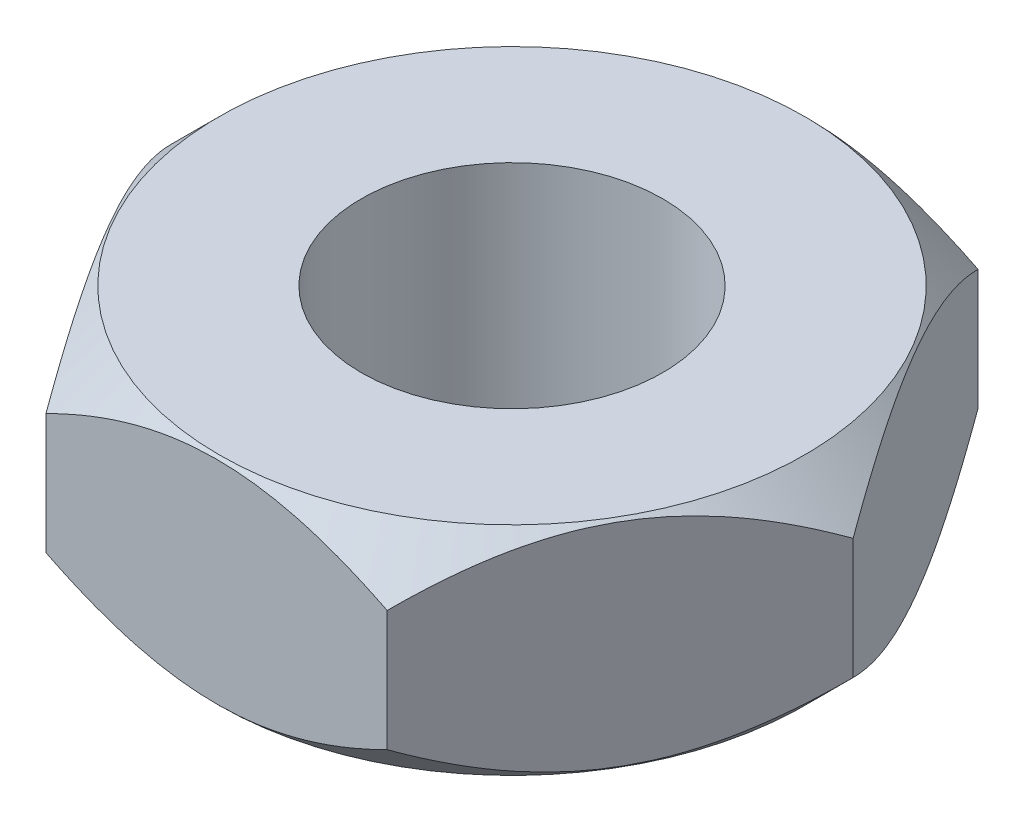
ISO-10303-21;
HEADER;
FILE_DESCRIPTION(('STEP AP214'),'2;1');
FILE_NAME('part.step','',(''),(''),'','','');
FILE_SCHEMA(('AUTOMOTIVE_DESIGN { 1 0 10303 214 1 1 1 1 }'));
ENDSEC;
DATA;
#1=APPLICATION_CONTEXT('core data for automotive mechanical design processes');
#2=APPLICATION_PROTOCOL_DEFINITION('international standard','automotive_design',2000,#1);
#3=PRODUCT_CONTEXT('',#1,'mechanical');
#4=PRODUCT('Part','Part','',(#3));
#5=PRODUCT_RELATED_PRODUCT_CATEGORY('part','',(#4));
#6=PRODUCT_DEFINITION_FORMATION('','',#4);
#7=PRODUCT_DEFINITION_CONTEXT('part definition',#1,'design');
#8=PRODUCT_DEFINITION('design','',#6,#7);
#9=PRODUCT_DEFINITION_SHAPE('','',#8);
#10=(LENGTH_UNIT() NAMED_UNIT(*) SI_UNIT(.MILLI.,.METRE.));
#11=(NAMED_UNIT(*) PLANE_ANGLE_UNIT() SI_UNIT($,.RADIAN.));
#12=(NAMED_UNIT(*) SI_UNIT($,.STERADIAN.) SOLID_ANGLE_UNIT());
#13=UNCERTAINTY_MEASURE_WITH_UNIT(LENGTH_MEASURE(1.E-05),#10,'distance_accuracy_value','');
#14=(GEOMETRIC_REPRESENTATION_CONTEXT(3) GLOBAL_UNCERTAINTY_ASSIGNED_CONTEXT((#13)) GLOBAL_UNIT_ASSIGNED_CONTEXT((#10,
#11,#12)) REPRESENTATION_CONTEXT('',''));
#15=CARTESIAN_POINT('',(0.,0.,0.));
#16=DIRECTION('',(0.,0.,1.));
#17=DIRECTION('',(1.,0.,0.));
#18=AXIS2_PLACEMENT_3D('',#15,#16,#17);
#19=CARTESIAN_POINT('',(0.,0.,0.));
#20=DIRECTION('',(0.,1.,0.));
#21=DIRECTION('',(0.,0.,1.));
#22=AXIS2_PLACEMENT_3D('',#19,#20,#21);
#23=PLANE('',#22);
#24=CARTESIAN_POINT('',(0.,0.,0.));
#25=DIRECTION('',(0.,1.,0.));
#26=DIRECTION('',(0.,0.,1.));
#27=AXIS2_PLACEMENT_3D('',#24,#25,#26);
#28=CIRCLE('',#27,1.25);
#29=CARTESIAN_POINT('',(0.,0.,1.25));
#30=VERTEX_POINT('',#29);
#31=EDGE_CURVE('E241',#30,#30,#28,.T.);
#32=ORIENTED_EDGE('',*,*,#31,.T.);
#33=EDGE_LOOP('',(#32));
#34=FACE_BOUND('',#33,.T.);
#35=CARTESIAN_POINT('',(0.,0.,0.));
#36=DIRECTION('',(0.,1.,0.));
#37=DIRECTION('',(0.,0.,1.));
#38=AXIS2_PLACEMENT_3D('',#35,#36,#37);
#39=CIRCLE('',#38,2.42901631902917);
#40=CARTESIAN_POINT('',(0.,0.,2.42901631902917));
#41=VERTEX_POINT('',#40);
#42=EDGE_CURVE('E113',#41,#41,#39,.T.);
#43=ORIENTED_EDGE('',*,*,#42,.F.);
#44=EDGE_LOOP('',(#43));
#45=FACE_BOUND('',#44,.T.);
#46=ADVANCED_FACE('F39',(#34,#45),#23,.F.);
#47=CARTESIAN_POINT('',(0.,1.8,0.));
#48=DIRECTION('',(0.,1.,0.));
#49=DIRECTION('',(0.,0.,1.));
#50=AXIS2_PLACEMENT_3D('',#47,#48,#49);
#51=PLANE('',#50);
#52=CARTESIAN_POINT('',(0.,1.8,0.));
#53=DIRECTION('',(0.,1.,0.));
#54=DIRECTION('',(0.,0.,1.));
#55=AXIS2_PLACEMENT_3D('',#52,#53,#54);
#56=CIRCLE('',#55,1.25);
#57=CARTESIAN_POINT('',(0.,1.8,1.25));
#58=VERTEX_POINT('',#57);
#59=EDGE_CURVE('E123',#58,#58,#56,.T.);
#60=ORIENTED_EDGE('',*,*,#59,.F.);
#61=EDGE_LOOP('',(#60));
#62=FACE_BOUND('',#61,.T.);
#63=CARTESIAN_POINT('',(0.,1.8,0.));
#64=DIRECTION('',(0.,1.,0.));
#65=DIRECTION('',(0.,0.,1.));
#66=AXIS2_PLACEMENT_3D('',#63,#64,#65);
#67=CIRCLE('',#66,2.42901631902917);
#68=CARTESIAN_POINT('',(0.,1.8,2.42901631902917));
#69=VERTEX_POINT('',#68);
#70=EDGE_CURVE('E222',#69,#69,#67,.T.);
#71=ORIENTED_EDGE('',*,*,#70,.T.);
#72=EDGE_LOOP('',(#71));
#73=FACE_BOUND('',#72,.T.);
#74=ADVANCED_FACE('F252',(#62,#73),#51,.T.);
#75=CARTESIAN_POINT('',(2.82901631902917,1.8,0.));
#76=DIRECTION('',(-0.866025403784438,0.,0.5));
#77=DIRECTION('',(0.5,0.,0.866025403784439));
#78=AXIS2_PLACEMENT_3D('',#75,#76,#77);
#79=PLANE('',#78);
#80=DIRECTION('',(0.,-1.,0.));
#81=VECTOR('',#80,1.);
#82=CARTESIAN_POINT('',(2.82901631902917,1.8,0.));
#83=LINE('',#82,#81);
#84=CARTESIAN_POINT('',(2.82901631902917,1.4,0.));
#85=VERTEX_POINT('',#84);
#86=CARTESIAN_POINT('',(2.82901631902917,0.4,0.));
#87=VERTEX_POINT('',#86);
#88=EDGE_CURVE('E117',#85,#87,#83,.T.);
#89=ORIENTED_EDGE('',*,*,#88,.T.);
#90=CARTESIAN_POINT('',(2.82913178908301,0.400115477123145,0.000199999999999504));
#91=CARTESIAN_POINT('',(2.78050749178405,0.351531943816685,-0.0840197534041309));
#92=CARTESIAN_POINT('',(2.73107012483881,0.305801731436073,-0.169647784745699));
#93=CARTESIAN_POINT('',(2.6302618520895,0.222070694541585,-0.344252834970767));
#94=CARTESIAN_POINT('',(2.57888135853392,0.184116459538144,-0.433246460327001));
#95=CARTESIAN_POINT('',(2.47527503835683,0.119100055169454,-0.612697870858978));
#96=CARTESIAN_POINT('',(2.42307559924255,0.0918744644052159,-0.703109951531505));
#97=CARTESIAN_POINT('',(2.3175275294839,0.0499277399986241,-0.885924570994309));
#98=CARTESIAN_POINT('',(2.26418212344496,0.0351752929292085,-0.978321524604146));
#99=CARTESIAN_POINT('',(2.17224460225891,0.0218648011828623,-1.13756198242032));
#100=CARTESIAN_POINT('',(2.1337712695682,0.0198943646775737,-1.20419974937713));
#101=CARTESIAN_POINT('',(2.0568874896419,0.0232135932201699,-1.33736636248743));
#102=CARTESIAN_POINT('',(2.01847706917854,0.028505803532813,-1.40389516227005));
#103=CARTESIAN_POINT('',(1.942018908021,0.0460491662814278,-1.5363245820482));
#104=CARTESIAN_POINT('',(1.90397162154857,0.0583081035916648,-1.60222441530857));
#105=CARTESIAN_POINT('',(1.82853497675801,0.0891119947496022,-1.73288451683836));
#106=CARTESIAN_POINT('',(1.79114556823417,0.107656466711311,-1.7976448720666));
#107=CARTESIAN_POINT('',(1.69537481345656,0.162710075568889,-1.96352468522063));
#108=CARTESIAN_POINT('',(1.63758730067765,0.203369132338794,-2.06361559339673));
#109=CARTESIAN_POINT('',(1.55261584194407,0.272007224329872,-2.21079047711654));
#110=CARTESIAN_POINT('',(1.52461395323958,0.296123497161931,-2.25929117106061));
#111=CARTESIAN_POINT('',(1.46912887056141,0.346554429845183,-2.35539415332136));
#112=CARTESIAN_POINT('',(1.44164537067441,0.372867740032936,-2.40299697149545));
#113=CARTESIAN_POINT('',(1.41439268946074,0.400115477123144,-2.4502));
#114=B_SPLINE_CURVE_WITH_KNOTS('',3,(#90,#91,#92,#93,#94,#95,#96,#97,#98,#99,#100,#101,#102,
#103,#104,#105,#106,#107,#108,#109,#110,#111,#112,#113),.UNSPECIFIED.,.F.,.F.,(4,2,2,2,2,2,2,2,
2,2,2,4),(0.,0.326352937962233,0.654607441550946,0.977648366171207,1.2998758783641,
1.53046472398209,1.76113440233005,1.9920623476298,2.22297259264043,2.58975777202036,
2.77265307102351,2.95543683068299),.UNSPECIFIED.);
#115=CARTESIAN_POINT('',(1.41450815951459,0.4,-2.45));
#116=VERTEX_POINT('',#115);
#117=EDGE_CURVE('E62',#87,#116,#114,.T.);
#118=ORIENTED_EDGE('',*,*,#117,.T.);
#119=DIRECTION('',(0.,-1.,0.));
#120=VECTOR('',#119,1.);
#121=CARTESIAN_POINT('',(1.41450815951458,1.8,-2.45));
#122=LINE('',#121,#120);
#123=CARTESIAN_POINT('',(1.41450815951459,1.4,-2.45));
#124=VERTEX_POINT('',#123);
#125=EDGE_CURVE('E134',#124,#116,#122,.T.);
#126=ORIENTED_EDGE('',*,*,#125,.F.);
#127=CARTESIAN_POINT('',(1.41439268946075,1.39988452287686,-2.4502));
#128=CARTESIAN_POINT('',(1.4630169867597,1.44846805618332,-2.36598024659587));
#129=CARTESIAN_POINT('',(1.51245435370494,1.49419826856393,-2.2803522152543));
#130=CARTESIAN_POINT('',(1.61326262645425,1.57792930545842,-2.10574716502923));
#131=CARTESIAN_POINT('',(1.66464312000983,1.61588354046186,-2.016753539673));
#132=CARTESIAN_POINT('',(1.76824944018692,1.68089994483055,-1.83730212914102));
#133=CARTESIAN_POINT('',(1.8204488793012,1.70812553559478,-1.7468900484685));
#134=CARTESIAN_POINT('',(1.92599694905985,1.75007226000138,-1.56407542900569));
#135=CARTESIAN_POINT('',(1.97934235509879,1.76482470707079,-1.47167847539586));
#136=CARTESIAN_POINT('',(2.07127987628484,1.77813519881714,-1.31243801757968));
#137=CARTESIAN_POINT('',(2.10975320897555,1.78010563532243,-1.24580025062287));
#138=CARTESIAN_POINT('',(2.18663698890185,1.77678640677983,-1.11263363751258));
#139=CARTESIAN_POINT('',(2.22504740936521,1.77149419646719,-1.04610483772995));
#140=CARTESIAN_POINT('',(2.30150557052275,1.75395083371857,-0.913675417951802));
#141=CARTESIAN_POINT('',(2.33955285699518,1.74169189640833,-0.84777558469143));
#142=CARTESIAN_POINT('',(2.41498950178574,1.7108880052504,-0.717115483161645));
#143=CARTESIAN_POINT('',(2.45237891030958,1.69234353328869,-0.652355127933404));
#144=CARTESIAN_POINT('',(2.54814966508719,1.63728992443111,-0.486475314779377));
#145=CARTESIAN_POINT('',(2.6059371778661,1.59663086766121,-0.386384406603269));
#146=CARTESIAN_POINT('',(2.69090863659968,1.52799277567013,-0.239209522883458));
#147=CARTESIAN_POINT('',(2.71891052530417,1.50387650283807,-0.190708828939396));
#148=CARTESIAN_POINT('',(2.77439560798234,1.45344557015482,-0.0946058466786421));
#149=CARTESIAN_POINT('',(2.80187910786934,1.42713225996706,-0.0470030285045498));
#150=CARTESIAN_POINT('',(2.82913178908301,1.39988452287686,0.000199999999999433));
#151=B_SPLINE_CURVE_WITH_KNOTS('',3,(#127,#128,#129,#130,#131,#132,#133,#134,#135,#136,#137,
#138,#139,#140,#141,#142,#143,#144,#145,#146,#147,#148,#149,#150),.UNSPECIFIED.,.F.,.F.,(4,2,2,
2,2,2,2,2,2,2,2,4),(0.,0.326352937962232,0.654607441550944,0.977648366171205,1.29987587836409,
1.53046472398209,1.76113440233005,1.9920623476298,2.22297259264043,2.58975777202036,
2.77265307102351,2.95543683068299),.UNSPECIFIED.);
#152=EDGE_CURVE('E188',#124,#85,#151,.T.);
#153=ORIENTED_EDGE('',*,*,#152,.T.);
#154=EDGE_LOOP('',(#89,#118,#126,#153));
#155=FACE_BOUND('',#154,.T.);
#156=ADVANCED_FACE('F41',(#155),#79,.F.);
#157=CARTESIAN_POINT('',(1.41450815951458,1.8,-2.45));
#158=DIRECTION('',(0.,0.,1.));
#159=DIRECTION('',(1.,0.,0.));
#160=AXIS2_PLACEMENT_3D('',#157,#158,#159);
#161=PLANE('',#160);
#162=ORIENTED_EDGE('',*,*,#125,.T.);
#163=CARTESIAN_POINT('',(4.27186292139454,2.49554587665742,-2.45));
#164=CARTESIAN_POINT('',(4.14551153302819,2.38598406192926,-2.45));
#165=CARTESIAN_POINT('',(4.01859865175386,2.27705642977799,-2.45));
#166=CARTESIAN_POINT('',(3.76321447753472,2.06092177782122,-2.45));
#167=CARTESIAN_POINT('',(3.6347424725801,1.95371560038954,-2.45));
#168=CARTESIAN_POINT('',(3.37295254295558,1.73914571047158,-2.45));
#169=CARTESIAN_POINT('',(3.23959108340829,1.63183490469603,-2.45));
#170=CARTESIAN_POINT('',(2.97035431990019,1.4204688538915,-2.45));
#171=CARTESIAN_POINT('',(2.83447965425152,1.31641279979837,-2.45));
#172=CARTESIAN_POINT('',(2.55920228372678,1.11265307836512,-2.45));
#173=CARTESIAN_POINT('',(2.4197951075342,1.01295541209634,-2.45));
#174=CARTESIAN_POINT('',(2.13639207785251,0.819964170547471,-2.45));
#175=CARTESIAN_POINT('',(1.99239260103339,0.726675844932527,-2.45));
#176=CARTESIAN_POINT('',(1.69959705459969,0.550500353680368,-2.45));
#177=CARTESIAN_POINT('',(1.55084639414118,0.467538709868794,-2.45));
#178=CARTESIAN_POINT('',(1.24600447328249,0.316447313920822,-2.45));
#179=CARTESIAN_POINT('',(1.08992736026093,0.248290299667585,-2.45));
#180=CARTESIAN_POINT('',(0.847878222934536,0.162423442207641,-2.45));
#181=CARTESIAN_POINT('',(0.76489354746257,0.136332394763868,-2.45));
#182=CARTESIAN_POINT('',(0.596967225292628,0.0913664546315873,-2.45));
#183=CARTESIAN_POINT('',(0.512025893204577,0.0724904103151569,-2.45));
#184=CARTESIAN_POINT('',(0.341210118144986,0.0432090804314749,-2.45));
#185=CARTESIAN_POINT('',(0.255344716626254,0.0327520389968132,-2.45));
#186=CARTESIAN_POINT('',(0.0829856214669755,0.0208817831477808,-2.45));
#187=CARTESIAN_POINT('',(-0.00350800458784327,0.0194676098978603,-2.45));
#188=CARTESIAN_POINT('',(-0.176268590614348,0.0257965616657364,-2.45));
#189=CARTESIAN_POINT('',(-0.262535088205447,0.0335520266523028,-2.45));
#190=CARTESIAN_POINT('',(-0.43385077999469,0.0576529809683251,-2.45));
#191=CARTESIAN_POINT('',(-0.518899730533234,0.0740001656827407,-2.45));
#192=CARTESIAN_POINT('',(-0.687767208797417,0.114356463620096,-2.45));
#193=CARTESIAN_POINT('',(-0.771572683915479,0.138419241684951,-2.45));
#194=CARTESIAN_POINT('',(-0.937057576452355,0.19290428108841,-2.45));
#195=CARTESIAN_POINT('',(-1.01873696884641,0.223326617243275,-2.45));
#196=CARTESIAN_POINT('',(-1.19804907671647,0.296731924694768,-2.45));
#197=CARTESIAN_POINT('',(-1.29515055097318,0.341001671133104,-2.45));
#198=CARTESIAN_POINT('',(-1.48646278142325,0.435446387900791,-2.45));
#199=CARTESIAN_POINT('',(-1.58067182882374,0.485624767415403,-2.45));
#200=CARTESIAN_POINT('',(-1.76673188803279,0.590574779627123,-2.45));
#201=CARTESIAN_POINT('',(-1.85857761498132,0.645355705428766,-2.45));
#202=CARTESIAN_POINT('',(-2.04008281492777,0.758364857132515,-2.45));
#203=CARTESIAN_POINT('',(-2.12974271721017,0.816592398310407,-2.45));
#204=CARTESIAN_POINT('',(-2.30771997179025,0.936053823858122,-2.45));
#205=CARTESIAN_POINT('',(-2.39602766490823,0.997302032388855,-2.45));
#206=CARTESIAN_POINT('',(-2.57111481221653,1.12195021618773,-2.45));
#207=CARTESIAN_POINT('',(-2.65789415046204,1.18535035364769,-2.45));
#208=CARTESIAN_POINT('',(-2.91611438553936,1.37795249172371,-2.45));
#209=CARTESIAN_POINT('',(-3.08565185321096,1.50970327610133,-2.45));
#210=CARTESIAN_POINT('',(-3.42724046011718,1.78258658306106,-2.45));
#211=CARTESIAN_POINT('',(-3.59915695758109,1.92388600119051,-2.45));
#212=CARTESIAN_POINT('',(-3.8540020594881,2.13757318007686,-2.45));
#213=CARTESIAN_POINT('',(-3.93799446029769,2.20869847153329,-2.45));
#214=CARTESIAN_POINT('',(-4.1053632260958,2.35163408126385,-2.45));
#215=CARTESIAN_POINT('',(-4.18873972031461,2.42344424814846,-2.45));
#216=CARTESIAN_POINT('',(-4.27186292139454,2.49554587665742,-2.45));
#217=B_SPLINE_CURVE_WITH_KNOTS('',3,(#163,#164,#165,#166,#167,#168,#169,#170,#171,#172,#173,
#174,#175,#176,#177,#178,#179,#180,#181,#182,#183,#184,#185,#186,#187,#188,#189,#190,#191,#192,
#193,#194,#195,#196,#197,#198,#199,#200,#201,#202,#203,#204,#205,#206,#207,#208,#209,#210,#211,
#212,#213,#214,#215,#216),.UNSPECIFIED.,.F.,.F.,(4,2,2,2,2,2,2,2,2,2,2,2,2,2,2,2,2,2,2,2,2,2,2,
2,2,2,4),(0.,0.501724217254908,1.00368689273523,1.51717555137169,2.03053553619984,
2.54458143132047,3.05904346401958,3.56954871210008,4.07910576272412,4.33981440286418,
4.60048141241221,4.85953346507799,5.11855804941938,5.37793161118708,5.63735637379002,
5.89862616725506,6.15989903457032,6.47977845371037,6.79984335087857,7.12057078820679,
7.44123472047046,7.76360168279388,8.08599299624604,8.72999642841388,9.39754020272861,
9.7277215400781,10.0578315096794),.UNSPECIFIED.);
#218=CARTESIAN_POINT('',(-1.41450815951458,0.4,-2.45));
#219=VERTEX_POINT('',#218);
#220=EDGE_CURVE('E202',#116,#219,#217,.T.);
#221=ORIENTED_EDGE('',*,*,#220,.T.);
#222=DIRECTION('',(0.,-1.,0.));
#223=VECTOR('',#222,1.);
#224=CARTESIAN_POINT('',(-1.41450815951458,1.8,-2.45));
#225=LINE('',#224,#223);
#226=CARTESIAN_POINT('',(-1.41450815951458,1.4,-2.45));
#227=VERTEX_POINT('',#226);
#228=EDGE_CURVE('E130',#227,#219,#225,.T.);
#229=ORIENTED_EDGE('',*,*,#228,.F.);
#230=CARTESIAN_POINT('',(-4.27186292139454,-0.695545876657422,-2.45));
#231=CARTESIAN_POINT('',(-4.14551153302819,-0.585984061929255,-2.45));
#232=CARTESIAN_POINT('',(-4.01859865175386,-0.47705642977799,-2.45));
#233=CARTESIAN_POINT('',(-3.76321447753472,-0.260921777821218,-2.45));
#234=CARTESIAN_POINT('',(-3.6347424725801,-0.153715600389544,-2.45));
#235=CARTESIAN_POINT('',(-3.37295254295558,0.0608542895284178,-2.45));
#236=CARTESIAN_POINT('',(-3.23959108340829,0.168165095303967,-2.45));
#237=CARTESIAN_POINT('',(-2.97035431990019,0.379531146108499,-2.45));
#238=CARTESIAN_POINT('',(-2.83447965425152,0.483587200201632,-2.45));
#239=CARTESIAN_POINT('',(-2.55920228372678,0.68734692163488,-2.45));
#240=CARTESIAN_POINT('',(-2.4197951075342,0.787044587903664,-2.45));
#241=CARTESIAN_POINT('',(-2.13639207785251,0.98003582945253,-2.45));
#242=CARTESIAN_POINT('',(-1.99239260103339,1.07332415506747,-2.45));
#243=CARTESIAN_POINT('',(-1.69959705459969,1.24949964631963,-2.45));
#244=CARTESIAN_POINT('',(-1.55084639414118,1.33246129013121,-2.45));
#245=CARTESIAN_POINT('',(-1.24600447328249,1.48355268607918,-2.45));
#246=CARTESIAN_POINT('',(-1.08992736026093,1.55170970033241,-2.45));
#247=CARTESIAN_POINT('',(-0.847878222934535,1.63757655779236,-2.45));
#248=CARTESIAN_POINT('',(-0.764893547462569,1.66366760523613,-2.45));
#249=CARTESIAN_POINT('',(-0.596967225292627,1.70863354536841,-2.45));
#250=CARTESIAN_POINT('',(-0.512025893204577,1.72750958968484,-2.45));
#251=CARTESIAN_POINT('',(-0.341210118144986,1.75679091956853,-2.45));
#252=CARTESIAN_POINT('',(-0.255344716626253,1.76724796100319,-2.45));
#253=CARTESIAN_POINT('',(-0.0829856214669752,1.77911821685222,-2.45));
#254=CARTESIAN_POINT('',(0.00350800458784353,1.78053239010214,-2.45));
#255=CARTESIAN_POINT('',(0.176268590614348,1.77420343833426,-2.45));
#256=CARTESIAN_POINT('',(0.262535088205447,1.7664479733477,-2.45));
#257=CARTESIAN_POINT('',(0.433850779994689,1.74234701903167,-2.45));
#258=CARTESIAN_POINT('',(0.518899730533233,1.72599983431726,-2.45));
#259=CARTESIAN_POINT('',(0.687767208797416,1.6856435363799,-2.45));
#260=CARTESIAN_POINT('',(0.771572683915479,1.66158075831505,-2.45));
#261=CARTESIAN_POINT('',(0.937057576452354,1.60709571891159,-2.45));
#262=CARTESIAN_POINT('',(1.01873696884641,1.57667338275673,-2.45));
#263=CARTESIAN_POINT('',(1.19804907671647,1.50326807530523,-2.45));
#264=CARTESIAN_POINT('',(1.29515055097318,1.4589983288669,-2.45));
#265=CARTESIAN_POINT('',(1.48646278142325,1.36455361209921,-2.45));
#266=CARTESIAN_POINT('',(1.58067182882374,1.3143752325846,-2.45));
#267=CARTESIAN_POINT('',(1.76673188803279,1.20942522037288,-2.45));
#268=CARTESIAN_POINT('',(1.85857761498132,1.15464429457123,-2.45));
#269=CARTESIAN_POINT('',(2.04008281492777,1.04163514286748,-2.45));
#270=CARTESIAN_POINT('',(2.12974271721017,0.983407601689593,-2.45));
#271=CARTESIAN_POINT('',(2.30771997179025,0.863946176141878,-2.45));
#272=CARTESIAN_POINT('',(2.39602766490822,0.802697967611145,-2.45));
#273=CARTESIAN_POINT('',(2.57111481221653,0.678049783812272,-2.45));
#274=CARTESIAN_POINT('',(2.65789415046204,0.614649646352306,-2.45));
#275=CARTESIAN_POINT('',(2.91611438553936,0.422047508276293,-2.45));
#276=CARTESIAN_POINT('',(3.08565185321096,0.290296723898673,-2.45));
#277=CARTESIAN_POINT('',(3.42724046011718,0.0174134169389441,-2.45));
#278=CARTESIAN_POINT('',(3.59915695758109,-0.12388600119051,-2.45));
#279=CARTESIAN_POINT('',(3.8540020594881,-0.33757318007686,-2.45));
#280=CARTESIAN_POINT('',(3.93799446029769,-0.408698471533291,-2.45));
#281=CARTESIAN_POINT('',(4.1053632260958,-0.551634081263854,-2.45));
#282=CARTESIAN_POINT('',(4.18873972031461,-0.623444248148463,-2.45));
#283=CARTESIAN_POINT('',(4.27186292139454,-0.695545876657422,-2.45));
#284=B_SPLINE_CURVE_WITH_KNOTS('',3,(#230,#231,#232,#233,#234,#235,#236,#237,#238,#239,#240,
#241,#242,#243,#244,#245,#246,#247,#248,#249,#250,#251,#252,#253,#254,#255,#256,#257,#258,#259,
#260,#261,#262,#263,#264,#265,#266,#267,#268,#269,#270,#271,#272,#273,#274,#275,#276,#277,#278,
#279,#280,#281,#282,#283),.UNSPECIFIED.,.F.,.F.,(4,2,2,2,2,2,2,2,2,2,2,2,2,2,2,2,2,2,2,2,2,2,2,
2,2,2,4),(0.,0.501724217254908,1.00368689273523,1.51717555137169,2.03053553619984,
2.54458143132047,3.05904346401958,3.56954871210008,4.07910576272412,4.33981440286417,
4.60048141241221,4.85953346507799,5.11855804941938,5.37793161118708,5.63735637379002,
5.89862616725506,6.15989903457032,6.47977845371037,6.79984335087857,7.12057078820679,
7.44123472047046,7.76360168279387,8.08599299624604,8.72999642841388,9.39754020272861,
9.7277215400781,10.0578315096794),.UNSPECIFIED.);
#285=EDGE_CURVE('E181',#227,#124,#284,.T.);
#286=ORIENTED_EDGE('',*,*,#285,.T.);
#287=EDGE_LOOP('',(#162,#221,#229,#286));
#288=FACE_BOUND('',#287,.T.);
#289=ADVANCED_FACE('F194',(#288),#161,.F.);
#290=CARTESIAN_POINT('',(-1.41450815951458,1.8,-2.45));
#291=DIRECTION('',(0.866025403784439,0.,0.5));
#292=DIRECTION('',(0.5,0.,-0.866025403784439));
#293=AXIS2_PLACEMENT_3D('',#290,#291,#292);
#294=PLANE('',#293);
#295=ORIENTED_EDGE('',*,*,#228,.T.);
#296=CARTESIAN_POINT('',(-1.41439268946074,0.400115477123143,-2.4502));
#297=CARTESIAN_POINT('',(-1.4630169867597,0.351531943816684,-2.36598024659587));
#298=CARTESIAN_POINT('',(-1.51245435370494,0.305801731436072,-2.2803522152543));
#299=CARTESIAN_POINT('',(-1.61326262645425,0.222070694541584,-2.10574716502923));
#300=CARTESIAN_POINT('',(-1.66464312000983,0.184116459538142,-2.016753539673));
#301=CARTESIAN_POINT('',(-1.76824944018692,0.119100055169453,-1.83730212914102));
#302=CARTESIAN_POINT('',(-1.8204488793012,0.0918744644052142,-1.74689004846849));
#303=CARTESIAN_POINT('',(-1.92599694905985,0.0499277399986224,-1.56407542900569));
#304=CARTESIAN_POINT('',(-1.97934235509879,0.0351752929292067,-1.47167847539585));
#305=CARTESIAN_POINT('',(-2.07127987628484,0.0218648011828606,-1.31243801757968));
#306=CARTESIAN_POINT('',(-2.10975320897555,0.0198943646775722,-1.24580025062287));
#307=CARTESIAN_POINT('',(-2.18663698890185,0.0232135932201683,-1.11263363751258));
#308=CARTESIAN_POINT('',(-2.22504740936521,0.0285058035328113,-1.04610483772995));
#309=CARTESIAN_POINT('',(-2.30150557052275,0.0460491662814259,-0.913675417951799));
#310=CARTESIAN_POINT('',(-2.33955285699518,0.0583081035916627,-0.847775584691427));
#311=CARTESIAN_POINT('',(-2.41498950178574,0.0891119947496001,-0.717115483161642));
#312=CARTESIAN_POINT('',(-2.45237891030958,0.10765646671131,-0.652355127933401));
#313=CARTESIAN_POINT('',(-2.54814966508718,0.162710075568887,-0.486475314779374));
#314=CARTESIAN_POINT('',(-2.60593717786609,0.203369132338791,-0.386384406603266));
#315=CARTESIAN_POINT('',(-2.69090863659968,0.27200722432987,-0.239209522883455));
#316=CARTESIAN_POINT('',(-2.71891052530417,0.29612349716193,-0.190708828939394));
#317=CARTESIAN_POINT('',(-2.77439560798234,0.346554429845182,-0.0946058466786403));
#318=CARTESIAN_POINT('',(-2.80187910786934,0.372867740032935,-0.0470030285045479));
#319=CARTESIAN_POINT('',(-2.829131789083,0.400115477123143,0.000200000000001428));
#320=B_SPLINE_CURVE_WITH_KNOTS('',3,(#296,#297,#298,#299,#300,#301,#302,#303,#304,#305,#306,
#307,#308,#309,#310,#311,#312,#313,#314,#315,#316,#317,#318,#319),.UNSPECIFIED.,.F.,.F.,(4,2,2,
2,2,2,2,2,2,2,2,4),(0.,0.326352937962233,0.654607441550946,0.977648366171207,1.2998758783641,
1.53046472398209,1.76113440233005,1.9920623476298,2.22297259264043,2.58975777202036,
2.77265307102351,2.95543683068299),.UNSPECIFIED.);
#321=CARTESIAN_POINT('',(-2.82901631902917,0.4,0.));
#322=VERTEX_POINT('',#321);
#323=EDGE_CURVE('E211',#219,#322,#320,.T.);
#324=ORIENTED_EDGE('',*,*,#323,.T.);
#325=DIRECTION('',(0.,-1.,0.));
#326=VECTOR('',#325,1.);
#327=CARTESIAN_POINT('',(-2.82901631902917,1.8,0.));
#328=LINE('',#327,#326);
#329=CARTESIAN_POINT('',(-2.82901631902917,1.4,0.));
#330=VERTEX_POINT('',#329);
#331=EDGE_CURVE('E121',#330,#322,#328,.T.);
#332=ORIENTED_EDGE('',*,*,#331,.F.);
#333=CARTESIAN_POINT('',(-2.829131789083,1.39988452287686,0.000200000000001365));
#334=CARTESIAN_POINT('',(-2.78050749178404,1.44846805618332,-0.0840197534041292));
#335=CARTESIAN_POINT('',(-2.73107012483881,1.49419826856393,-0.169647784745697));
#336=CARTESIAN_POINT('',(-2.6302618520895,1.57792930545842,-0.344252834970765));
#337=CARTESIAN_POINT('',(-2.57888135853392,1.61588354046186,-0.433246460326998));
#338=CARTESIAN_POINT('',(-2.47527503835682,1.68089994483055,-0.612697870858975));
#339=CARTESIAN_POINT('',(-2.42307559924255,1.70812553559479,-0.703109951531502));
#340=CARTESIAN_POINT('',(-2.3175275294839,1.75007226000138,-0.885924570994306));
#341=CARTESIAN_POINT('',(-2.26418212344496,1.76482470707079,-0.978321524604143));
#342=CARTESIAN_POINT('',(-2.17224460225891,1.77813519881714,-1.13756198242032));
#343=CARTESIAN_POINT('',(-2.1337712695682,1.78010563532243,-1.20419974937713));
#344=CARTESIAN_POINT('',(-2.0568874896419,1.77678640677983,-1.33736636248742));
#345=CARTESIAN_POINT('',(-2.01847706917854,1.77149419646719,-1.40389516227005));
#346=CARTESIAN_POINT('',(-1.942018908021,1.75395083371857,-1.5363245820482));
#347=CARTESIAN_POINT('',(-1.90397162154857,1.74169189640834,-1.60222441530857));
#348=CARTESIAN_POINT('',(-1.82853497675801,1.7108880052504,-1.73288451683836));
#349=CARTESIAN_POINT('',(-1.79114556823417,1.69234353328869,-1.7976448720666));
#350=CARTESIAN_POINT('',(-1.69537481345656,1.63728992443111,-1.96352468522062));
#351=CARTESIAN_POINT('',(-1.63758730067765,1.59663086766121,-2.06361559339673));
#352=CARTESIAN_POINT('',(-1.55261584194407,1.52799277567013,-2.21079047711654));
#353=CARTESIAN_POINT('',(-1.52461395323958,1.50387650283807,-2.2592911710606));
#354=CARTESIAN_POINT('',(-1.46912887056141,1.45344557015482,-2.35539415332136));
#355=CARTESIAN_POINT('',(-1.44164537067441,1.42713225996706,-2.40299697149545));
#356=CARTESIAN_POINT('',(-1.41439268946074,1.39988452287686,-2.4502));
#357=B_SPLINE_CURVE_WITH_KNOTS('',3,(#333,#334,#335,#336,#337,#338,#339,#340,#341,#342,#343,
#344,#345,#346,#347,#348,#349,#350,#351,#352,#353,#354,#355,#356),.UNSPECIFIED.,.F.,.F.,(4,2,2,
2,2,2,2,2,2,2,2,4),(0.,0.326352937962232,0.654607441550945,0.977648366171206,1.29987587836409,
1.53046472398209,1.76113440233005,1.9920623476298,2.22297259264043,2.58975777202036,
2.77265307102351,2.95543683068299),.UNSPECIFIED.);
#358=EDGE_CURVE('E174',#330,#227,#357,.T.);
#359=ORIENTED_EDGE('',*,*,#358,.T.);
#360=EDGE_LOOP('',(#295,#324,#332,#359));
#361=FACE_BOUND('',#360,.T.);
#362=ADVANCED_FACE('F197',(#361),#294,.F.);
#363=CARTESIAN_POINT('',(-2.82901631902917,1.8,0.));
#364=DIRECTION('',(0.866025403784438,0.,-0.5));
#365=DIRECTION('',(-0.5,0.,-0.866025403784439));
#366=AXIS2_PLACEMENT_3D('',#363,#364,#365);
#367=PLANE('',#366);
#368=ORIENTED_EDGE('',*,*,#331,.T.);
#369=CARTESIAN_POINT('',(-2.829131789083,0.400115477123142,-0.000199999999998685));
#370=CARTESIAN_POINT('',(-2.78050749178404,0.351531943816683,0.0840197534041316));
#371=CARTESIAN_POINT('',(-2.73107012483881,0.305801731436071,0.1696477847457));
#372=CARTESIAN_POINT('',(-2.6302618520895,0.222070694541583,0.344252834970768));
#373=CARTESIAN_POINT('',(-2.57888135853392,0.184116459538142,0.433246460327));
#374=CARTESIAN_POINT('',(-2.47527503835682,0.119100055169453,0.612697870858978));
#375=CARTESIAN_POINT('',(-2.42307559924255,0.0918744644052145,0.703109951531504));
#376=CARTESIAN_POINT('',(-2.3175275294839,0.0499277399986225,0.885924570994308));
#377=CARTESIAN_POINT('',(-2.26418212344496,0.0351752929292069,0.978321524604144));
#378=CARTESIAN_POINT('',(-2.17224460225891,0.0218648011828609,1.13756198242032));
#379=CARTESIAN_POINT('',(-2.1337712695682,0.0198943646775725,1.20419974937713));
#380=CARTESIAN_POINT('',(-2.0568874896419,0.0232135932201685,1.33736636248742));
#381=CARTESIAN_POINT('',(-2.01847706917854,0.0285058035328112,1.40389516227005));
#382=CARTESIAN_POINT('',(-1.942018908021,0.0460491662814259,1.5363245820482));
#383=CARTESIAN_POINT('',(-1.90397162154857,0.058308103591663,1.60222441530857));
#384=CARTESIAN_POINT('',(-1.82853497675801,0.0891119947496005,1.73288451683836));
#385=CARTESIAN_POINT('',(-1.79114556823416,0.10765646671131,1.7976448720666));
#386=CARTESIAN_POINT('',(-1.69537481345656,0.162710075568887,1.96352468522062));
#387=CARTESIAN_POINT('',(-1.63758730067765,0.203369132338792,2.06361559339673));
#388=CARTESIAN_POINT('',(-1.55261584194407,0.272007224329871,2.21079047711654));
#389=CARTESIAN_POINT('',(-1.52461395323958,0.296123497161931,2.25929117106061));
#390=CARTESIAN_POINT('',(-1.46912887056141,0.346554429845183,2.35539415332136));
#391=CARTESIAN_POINT('',(-1.44164537067441,0.372867740032936,2.40299697149545));
#392=CARTESIAN_POINT('',(-1.41439268946074,0.400115477123144,2.4502));
#393=B_SPLINE_CURVE_WITH_KNOTS('',3,(#369,#370,#371,#372,#373,#374,#375,#376,#377,#378,#379,
#380,#381,#382,#383,#384,#385,#386,#387,#388,#389,#390,#391,#392),.UNSPECIFIED.,.F.,.F.,(4,2,2,
2,2,2,2,2,2,2,2,4),(0.,0.326352937962233,0.654607441550945,0.977648366171205,1.29987587836409,
1.53046472398209,1.76113440233005,1.9920623476298,2.22297259264043,2.58975777202036,
2.77265307102351,2.95543683068299),.UNSPECIFIED.);
#394=CARTESIAN_POINT('',(-1.41450815951458,0.4,2.45));
#395=VERTEX_POINT('',#394);
#396=EDGE_CURVE('E112',#322,#395,#393,.T.);
#397=ORIENTED_EDGE('',*,*,#396,.T.);
#398=DIRECTION('',(0.,-1.,0.));
#399=VECTOR('',#398,1.);
#400=CARTESIAN_POINT('',(-1.41450815951458,1.8,2.45));
#401=LINE('',#400,#399);
#402=CARTESIAN_POINT('',(-1.41450815951458,1.4,2.45));
#403=VERTEX_POINT('',#402);
#404=EDGE_CURVE('E110',#403,#395,#401,.T.);
#405=ORIENTED_EDGE('',*,*,#404,.F.);
#406=CARTESIAN_POINT('',(-1.41439268946074,1.39988452287686,2.4502));
#407=CARTESIAN_POINT('',(-1.4630169867597,1.44846805618332,2.36598024659587));
#408=CARTESIAN_POINT('',(-1.51245435370493,1.49419826856393,2.2803522152543));
#409=CARTESIAN_POINT('',(-1.61326262645425,1.57792930545842,2.10574716502923));
#410=CARTESIAN_POINT('',(-1.66464312000983,1.61588354046186,2.016753539673));
#411=CARTESIAN_POINT('',(-1.76824944018692,1.68089994483055,1.83730212914102));
#412=CARTESIAN_POINT('',(-1.8204488793012,1.70812553559479,1.7468900484685));
#413=CARTESIAN_POINT('',(-1.92599694905985,1.75007226000138,1.56407542900569));
#414=CARTESIAN_POINT('',(-1.97934235509879,1.76482470707079,1.47167847539586));
#415=CARTESIAN_POINT('',(-2.07127987628484,1.77813519881714,1.31243801757968));
#416=CARTESIAN_POINT('',(-2.10975320897555,1.78010563532243,1.24580025062287));
#417=CARTESIAN_POINT('',(-2.18663698890185,1.77678640677983,1.11263363751258));
#418=CARTESIAN_POINT('',(-2.22504740936521,1.77149419646719,1.04610483772995));
#419=CARTESIAN_POINT('',(-2.30150557052275,1.75395083371857,0.913675417951802));
#420=CARTESIAN_POINT('',(-2.33955285699518,1.74169189640834,0.84777558469143));
#421=CARTESIAN_POINT('',(-2.41498950178574,1.7108880052504,0.717115483161645));
#422=CARTESIAN_POINT('',(-2.45237891030958,1.69234353328869,0.652355127933404));
#423=CARTESIAN_POINT('',(-2.54814966508718,1.63728992443111,0.486475314779377));
#424=CARTESIAN_POINT('',(-2.60593717786609,1.59663086766121,0.386384406603269));
#425=CARTESIAN_POINT('',(-2.69090863659968,1.52799277567013,0.239209522883458));
#426=CARTESIAN_POINT('',(-2.71891052530417,1.50387650283807,0.190708828939396));
#427=CARTESIAN_POINT('',(-2.77439560798234,1.45344557015482,0.0946058466786428));
#428=CARTESIAN_POINT('',(-2.80187910786934,1.42713225996706,0.0470030285045505));
#429=CARTESIAN_POINT('',(-2.829131789083,1.39988452287686,-0.000199999999998797));
#430=B_SPLINE_CURVE_WITH_KNOTS('',3,(#406,#407,#408,#409,#410,#411,#412,#413,#414,#415,#416,
#417,#418,#419,#420,#421,#422,#423,#424,#425,#426,#427,#428,#429),.UNSPECIFIED.,.F.,.F.,(4,2,2,
2,2,2,2,2,2,2,2,4),(0.,0.326352937962233,0.654607441550946,0.977648366171206,1.29987587836409,
1.53046472398209,1.76113440233005,1.9920623476298,2.22297259264043,2.58975777202036,
2.77265307102351,2.95543683068299),.UNSPECIFIED.);
#431=EDGE_CURVE('E167',#403,#330,#430,.T.);
#432=ORIENTED_EDGE('',*,*,#431,.T.);
#433=EDGE_LOOP('',(#368,#397,#405,#432));
#434=FACE_BOUND('',#433,.T.);
#435=ADVANCED_FACE('F276',(#434),#367,.F.);
#436=CARTESIAN_POINT('',(-1.41450815951458,1.8,2.45));
#437=DIRECTION('',(0.,0.,-1.));
#438=DIRECTION('',(-1.,0.,0.));
#439=AXIS2_PLACEMENT_3D('',#436,#437,#438);
#440=PLANE('',#439);
#441=ORIENTED_EDGE('',*,*,#404,.T.);
#442=CARTESIAN_POINT('',(-4.27186292139454,2.49554587665742,2.45));
#443=CARTESIAN_POINT('',(-4.14551153302819,2.38598406192925,2.45));
#444=CARTESIAN_POINT('',(-4.01859865175386,2.27705642977799,2.45));
#445=CARTESIAN_POINT('',(-3.76321447753472,2.06092177782122,2.45));
#446=CARTESIAN_POINT('',(-3.6347424725801,1.95371560038954,2.45));
#447=CARTESIAN_POINT('',(-3.37295254295558,1.73914571047158,2.45));
#448=CARTESIAN_POINT('',(-3.23959108340829,1.63183490469603,2.45));
#449=CARTESIAN_POINT('',(-2.97035431990019,1.4204688538915,2.45));
#450=CARTESIAN_POINT('',(-2.83447965425152,1.31641279979837,2.45));
#451=CARTESIAN_POINT('',(-2.55920228372678,1.11265307836512,2.45));
#452=CARTESIAN_POINT('',(-2.4197951075342,1.01295541209634,2.45));
#453=CARTESIAN_POINT('',(-2.13639207785251,0.819964170547471,2.45));
#454=CARTESIAN_POINT('',(-1.99239260103338,0.726675844932527,2.45));
#455=CARTESIAN_POINT('',(-1.69959705459969,0.550500353680368,2.45));
#456=CARTESIAN_POINT('',(-1.55084639414118,0.467538709868793,2.45));
#457=CARTESIAN_POINT('',(-1.24600447328249,0.316447313920822,2.45));
#458=CARTESIAN_POINT('',(-1.08992736026093,0.248290299667585,2.45));
#459=CARTESIAN_POINT('',(-0.847878222934535,0.162423442207641,2.45));
#460=CARTESIAN_POINT('',(-0.764893547462569,0.136332394763868,2.45));
#461=CARTESIAN_POINT('',(-0.596967225292627,0.0913664546315877,2.45));
#462=CARTESIAN_POINT('',(-0.512025893204577,0.0724904103151575,2.45));
#463=CARTESIAN_POINT('',(-0.341210118144986,0.0432090804314757,2.45));
#464=CARTESIAN_POINT('',(-0.255344716626253,0.0327520389968139,2.45));
#465=CARTESIAN_POINT('',(-0.0829856214669751,0.0208817831477815,2.45));
#466=CARTESIAN_POINT('',(0.00350800458784389,0.0194676098978609,2.45));
#467=CARTESIAN_POINT('',(0.176268590614349,0.025796561665737,2.45));
#468=CARTESIAN_POINT('',(0.262535088205448,0.0335520266523034,2.45));
#469=CARTESIAN_POINT('',(0.43385077999469,0.0576529809683257,2.45));
#470=CARTESIAN_POINT('',(0.518899730533234,0.0740001656827412,2.45));
#471=CARTESIAN_POINT('',(0.687767208797417,0.114356463620097,2.45));
#472=CARTESIAN_POINT('',(0.771572683915479,0.138419241684951,2.45));
#473=CARTESIAN_POINT('',(0.937057576452355,0.19290428108841,2.45));
#474=CARTESIAN_POINT('',(1.01873696884641,0.223326617243275,2.45));
#475=CARTESIAN_POINT('',(1.19804907671647,0.296731924694768,2.45));
#476=CARTESIAN_POINT('',(1.29515055097318,0.341001671133105,2.45));
#477=CARTESIAN_POINT('',(1.48646278142325,0.435446387900792,2.45));
#478=CARTESIAN_POINT('',(1.58067182882374,0.485624767415404,2.45));
#479=CARTESIAN_POINT('',(1.76673188803279,0.590574779627124,2.45));
#480=CARTESIAN_POINT('',(1.85857761498132,0.645355705428767,2.45));
#481=CARTESIAN_POINT('',(2.04008281492777,0.758364857132515,2.45));
#482=CARTESIAN_POINT('',(2.12974271721017,0.816592398310407,2.45));
#483=CARTESIAN_POINT('',(2.30771997179025,0.936053823858122,2.45));
#484=CARTESIAN_POINT('',(2.39602766490823,0.997302032388855,2.45));
#485=CARTESIAN_POINT('',(2.57111481221653,1.12195021618773,2.45));
#486=CARTESIAN_POINT('',(2.65789415046204,1.18535035364769,2.45));
#487=CARTESIAN_POINT('',(2.91611438553936,1.37795249172371,2.45));
#488=CARTESIAN_POINT('',(3.08565185321096,1.50970327610133,2.45));
#489=CARTESIAN_POINT('',(3.42724046011718,1.78258658306105,2.45));
#490=CARTESIAN_POINT('',(3.59915695758109,1.92388600119051,2.45));
#491=CARTESIAN_POINT('',(3.8540020594881,2.13757318007686,2.45));
#492=CARTESIAN_POINT('',(3.93799446029769,2.20869847153329,2.45));
#493=CARTESIAN_POINT('',(4.1053632260958,2.35163408126386,2.45));
#494=CARTESIAN_POINT('',(4.18873972031461,2.42344424814847,2.45));
#495=CARTESIAN_POINT('',(4.27186292139454,2.49554587665742,2.45));
#496=B_SPLINE_CURVE_WITH_KNOTS('',3,(#442,#443,#444,#445,#446,#447,#448,#449,#450,#451,#452,
#453,#454,#455,#456,#457,#458,#459,#460,#461,#462,#463,#464,#465,#466,#467,#468,#469,#470,#471,
#472,#473,#474,#475,#476,#477,#478,#479,#480,#481,#482,#483,#484,#485,#486,#487,#488,#489,#490,
#491,#492,#493,#494,#495),.UNSPECIFIED.,.F.,.F.,(4,2,2,2,2,2,2,2,2,2,2,2,2,2,2,2,2,2,2,2,2,2,2,
2,2,2,4),(0.,0.501724217254907,1.00368689273523,1.51717555137169,2.03053553619984,
2.54458143132047,3.05904346401957,3.56954871210008,4.07910576272412,4.33981440286417,
4.60048141241221,4.85953346507799,5.11855804941938,5.37793161118708,5.63735637379002,
5.89862616725506,6.15989903457032,6.47977845371037,6.79984335087857,7.12057078820679,
7.44123472047046,7.76360168279387,8.08599299624604,8.72999642841387,9.3975402027286,
9.7277215400781,10.0578315096794),.UNSPECIFIED.);
#497=CARTESIAN_POINT('',(1.41450815951459,0.4,2.45));
#498=VERTEX_POINT('',#497);
#499=EDGE_CURVE('E98',#395,#498,#496,.T.);
#500=ORIENTED_EDGE('',*,*,#499,.T.);
#501=DIRECTION('',(0.,-1.,0.));
#502=VECTOR('',#501,1.);
#503=CARTESIAN_POINT('',(1.41450815951458,1.8,2.45));
#504=LINE('',#503,#502);
#505=CARTESIAN_POINT('',(1.41450815951458,1.4,2.45));
#506=VERTEX_POINT('',#505);
#507=EDGE_CURVE('E108',#506,#498,#504,.T.);
#508=ORIENTED_EDGE('',*,*,#507,.F.);
#509=CARTESIAN_POINT('',(4.27186292139454,-0.695545876657423,2.45));
#510=CARTESIAN_POINT('',(4.14551153302819,-0.585984061929256,2.45));
#511=CARTESIAN_POINT('',(4.01859865175387,-0.477056429777991,2.45));
#512=CARTESIAN_POINT('',(3.76321447753472,-0.260921777821219,2.45));
#513=CARTESIAN_POINT('',(3.6347424725801,-0.153715600389546,2.45));
#514=CARTESIAN_POINT('',(3.37295254295558,0.0608542895284164,2.45));
#515=CARTESIAN_POINT('',(3.23959108340829,0.168165095303966,2.45));
#516=CARTESIAN_POINT('',(2.97035431990019,0.379531146108498,2.45));
#517=CARTESIAN_POINT('',(2.83447965425152,0.483587200201632,2.45));
#518=CARTESIAN_POINT('',(2.55920228372678,0.687346921634879,2.45));
#519=CARTESIAN_POINT('',(2.4197951075342,0.787044587903663,2.45));
#520=CARTESIAN_POINT('',(2.13639207785251,0.980035829452529,2.45));
#521=CARTESIAN_POINT('',(1.99239260103339,1.07332415506747,2.45));
#522=CARTESIAN_POINT('',(1.69959705459969,1.24949964631963,2.45));
#523=CARTESIAN_POINT('',(1.55084639414118,1.33246129013121,2.45));
#524=CARTESIAN_POINT('',(1.24600447328249,1.48355268607918,2.45));
#525=CARTESIAN_POINT('',(1.08992736026093,1.55170970033241,2.45));
#526=CARTESIAN_POINT('',(0.847878222934535,1.63757655779236,2.45));
#527=CARTESIAN_POINT('',(0.764893547462569,1.66366760523613,2.45));
#528=CARTESIAN_POINT('',(0.596967225292627,1.70863354536841,2.45));
#529=CARTESIAN_POINT('',(0.512025893204576,1.72750958968484,2.45));
#530=CARTESIAN_POINT('',(0.341210118144986,1.75679091956852,2.45));
#531=CARTESIAN_POINT('',(0.255344716626253,1.76724796100319,2.45));
#532=CARTESIAN_POINT('',(0.0829856214669749,1.77911821685222,2.45));
#533=CARTESIAN_POINT('',(-0.00350800458784383,1.78053239010214,2.45));
#534=CARTESIAN_POINT('',(-0.176268590614348,1.77420343833426,2.45));
#535=CARTESIAN_POINT('',(-0.262535088205447,1.7664479733477,2.45));
#536=CARTESIAN_POINT('',(-0.43385077999469,1.74234701903167,2.45));
#537=CARTESIAN_POINT('',(-0.518899730533234,1.72599983431726,2.45));
#538=CARTESIAN_POINT('',(-0.687767208797416,1.6856435363799,2.45));
#539=CARTESIAN_POINT('',(-0.771572683915479,1.66158075831505,2.45));
#540=CARTESIAN_POINT('',(-0.937057576452355,1.60709571891159,2.45));
#541=CARTESIAN_POINT('',(-1.01873696884641,1.57667338275672,2.45));
#542=CARTESIAN_POINT('',(-1.19804907671647,1.50326807530523,2.45));
#543=CARTESIAN_POINT('',(-1.29515055097318,1.45899832886689,2.45));
#544=CARTESIAN_POINT('',(-1.48646278142325,1.36455361209921,2.45));
#545=CARTESIAN_POINT('',(-1.58067182882374,1.3143752325846,2.45));
#546=CARTESIAN_POINT('',(-1.76673188803279,1.20942522037287,2.45));
#547=CARTESIAN_POINT('',(-1.85857761498132,1.15464429457123,2.45));
#548=CARTESIAN_POINT('',(-2.04008281492777,1.04163514286748,2.45));
#549=CARTESIAN_POINT('',(-2.12974271721018,0.983407601689591,2.45));
#550=CARTESIAN_POINT('',(-2.30771997179025,0.863946176141875,2.45));
#551=CARTESIAN_POINT('',(-2.39602766490823,0.802697967611142,2.45));
#552=CARTESIAN_POINT('',(-2.57111481221653,0.678049783812268,2.45));
#553=CARTESIAN_POINT('',(-2.65789415046204,0.614649646352302,2.45));
#554=CARTESIAN_POINT('',(-2.91611438553937,0.422047508276288,2.45));
#555=CARTESIAN_POINT('',(-3.08565185321097,0.290296723898668,2.45));
#556=CARTESIAN_POINT('',(-3.42724046011719,0.0174134169389413,2.45));
#557=CARTESIAN_POINT('',(-3.59915695758109,-0.123886001190512,2.45));
#558=CARTESIAN_POINT('',(-3.85400205948811,-0.337573180076862,2.45));
#559=CARTESIAN_POINT('',(-3.93799446029769,-0.408698471533293,2.45));
#560=CARTESIAN_POINT('',(-4.1053632260958,-0.551634081263856,2.45));
#561=CARTESIAN_POINT('',(-4.18873972031461,-0.623444248148464,2.45));
#562=CARTESIAN_POINT('',(-4.27186292139454,-0.695545876657421,2.45));
#563=B_SPLINE_CURVE_WITH_KNOTS('',3,(#509,#510,#511,#512,#513,#514,#515,#516,#517,#518,#519,
#520,#521,#522,#523,#524,#525,#526,#527,#528,#529,#530,#531,#532,#533,#534,#535,#536,#537,#538,
#539,#540,#541,#542,#543,#544,#545,#546,#547,#548,#549,#550,#551,#552,#553,#554,#555,#556,#557,
#558,#559,#560,#561,#562),.UNSPECIFIED.,.F.,.F.,(4,2,2,2,2,2,2,2,2,2,2,2,2,2,2,2,2,2,2,2,2,2,2,
2,2,2,4),(0.,0.501724217254908,1.00368689273523,1.51717555137169,2.03053553619984,
2.54458143132047,3.05904346401958,3.56954871210009,4.07910576272412,4.33981440286418,
4.60048141241221,4.85953346507799,5.11855804941938,5.37793161118708,5.63735637379003,
5.89862616725506,6.15989903457032,6.47977845371037,6.79984335087858,7.1205707882068,
7.44123472047047,7.76360168279388,8.08599299624605,8.72999642841388,9.39754020272861,
9.7277215400781,10.0578315096794),.UNSPECIFIED.);
#564=EDGE_CURVE('E69',#506,#403,#563,.T.);
#565=ORIENTED_EDGE('',*,*,#564,.T.);
#566=EDGE_LOOP('',(#441,#500,#508,#565));
#567=FACE_BOUND('',#566,.T.);
#568=ADVANCED_FACE('F107',(#567),#440,.F.);
#569=CARTESIAN_POINT('',(1.41450815951458,1.8,2.45));
#570=DIRECTION('',(-0.866025403784439,0.,-0.5));
#571=DIRECTION('',(-0.5,0.,0.866025403784439));
#572=AXIS2_PLACEMENT_3D('',#569,#570,#571);
#573=PLANE('',#572);
#574=ORIENTED_EDGE('',*,*,#507,.T.);
#575=CARTESIAN_POINT('',(1.41439268946075,0.400115477123145,2.4502));
#576=CARTESIAN_POINT('',(1.46301698675971,0.351531943816686,2.36598024659587));
#577=CARTESIAN_POINT('',(1.51245435370494,0.305801731436074,2.2803522152543));
#578=CARTESIAN_POINT('',(1.61326262645425,0.222070694541586,2.10574716502923));
#579=CARTESIAN_POINT('',(1.66464312000983,0.184116459538144,2.016753539673));
#580=CARTESIAN_POINT('',(1.76824944018693,0.119100055169455,1.83730212914102));
#581=CARTESIAN_POINT('',(1.8204488793012,0.0918744644052161,1.7468900484685));
#582=CARTESIAN_POINT('',(1.92599694905985,0.0499277399986242,1.56407542900569));
#583=CARTESIAN_POINT('',(1.97934235509879,0.0351752929292087,1.47167847539586));
#584=CARTESIAN_POINT('',(2.07127987628484,0.0218648011828627,1.31243801757968));
#585=CARTESIAN_POINT('',(2.10975320897555,0.0198943646775741,1.24580025062287));
#586=CARTESIAN_POINT('',(2.18663698890185,0.0232135932201702,1.11263363751258));
#587=CARTESIAN_POINT('',(2.22504740936521,0.0285058035328131,1.04610483772995));
#588=CARTESIAN_POINT('',(2.30150557052275,0.046049166281428,0.913675417951799));
#589=CARTESIAN_POINT('',(2.33955285699518,0.0583081035916653,0.847775584691427));
#590=CARTESIAN_POINT('',(2.41498950178574,0.0891119947496027,0.717115483161642));
#591=CARTESIAN_POINT('',(2.45237891030959,0.107656466711312,0.652355127933401));
#592=CARTESIAN_POINT('',(2.54814966508719,0.162710075568889,0.486475314779374));
#593=CARTESIAN_POINT('',(2.6059371778661,0.203369132338794,0.386384406603267));
#594=CARTESIAN_POINT('',(2.69090863659968,0.272007224329873,0.239209522883457));
#595=CARTESIAN_POINT('',(2.71891052530417,0.296123497161932,0.190708828939395));
#596=CARTESIAN_POINT('',(2.77439560798234,0.346554429845184,0.0946058466786414));
#597=CARTESIAN_POINT('',(2.80187910786934,0.372867740032937,0.047003028504549));
#598=CARTESIAN_POINT('',(2.829131789083,0.400115477123144,-0.000200000000000355));
#599=B_SPLINE_CURVE_WITH_KNOTS('',3,(#575,#576,#577,#578,#579,#580,#581,#582,#583,#584,#585,
#586,#587,#588,#589,#590,#591,#592,#593,#594,#595,#596,#597,#598),.UNSPECIFIED.,.F.,.F.,(4,2,2,
2,2,2,2,2,2,2,2,4),(0.,0.326352937962232,0.654607441550945,0.977648366171206,1.2998758783641,
1.53046472398209,1.76113440233005,1.9920623476298,2.22297259264043,2.58975777202036,
2.77265307102351,2.95543683068299),.UNSPECIFIED.);
#600=EDGE_CURVE('E11',#498,#87,#599,.T.);
#601=ORIENTED_EDGE('',*,*,#600,.T.);
#602=ORIENTED_EDGE('',*,*,#88,.F.);
#603=CARTESIAN_POINT('',(2.829131789083,1.39988452287686,-0.000200000000000546));
#604=CARTESIAN_POINT('',(2.78050749178405,1.44846805618331,0.0840197534041299));
#605=CARTESIAN_POINT('',(2.73107012483881,1.49419826856393,0.169647784745698));
#606=CARTESIAN_POINT('',(2.6302618520895,1.57792930545841,0.344252834970766));
#607=CARTESIAN_POINT('',(2.57888135853392,1.61588354046186,0.433246460326999));
#608=CARTESIAN_POINT('',(2.47527503835683,1.68089994483055,0.612697870858977));
#609=CARTESIAN_POINT('',(2.42307559924255,1.70812553559478,0.703109951531504));
#610=CARTESIAN_POINT('',(2.3175275294839,1.75007226000138,0.885924570994308));
#611=CARTESIAN_POINT('',(2.26418212344496,1.76482470707079,0.978321524604144));
#612=CARTESIAN_POINT('',(2.17224460225891,1.77813519881714,1.13756198242032));
#613=CARTESIAN_POINT('',(2.1337712695682,1.78010563532243,1.20419974937713));
#614=CARTESIAN_POINT('',(2.0568874896419,1.77678640677983,1.33736636248742));
#615=CARTESIAN_POINT('',(2.01847706917854,1.77149419646719,1.40389516227005));
#616=CARTESIAN_POINT('',(1.942018908021,1.75395083371857,1.5363245820482));
#617=CARTESIAN_POINT('',(1.90397162154857,1.74169189640833,1.60222441530857));
#618=CARTESIAN_POINT('',(1.82853497675801,1.7108880052504,1.73288451683836));
#619=CARTESIAN_POINT('',(1.79114556823417,1.69234353328869,1.7976448720666));
#620=CARTESIAN_POINT('',(1.69537481345656,1.63728992443111,1.96352468522062));
#621=CARTESIAN_POINT('',(1.63758730067765,1.59663086766121,2.06361559339673));
#622=CARTESIAN_POINT('',(1.55261584194407,1.52799277567013,2.21079047711654));
#623=CARTESIAN_POINT('',(1.52461395323958,1.50387650283807,2.25929117106061));
#624=CARTESIAN_POINT('',(1.46912887056141,1.45344557015482,2.35539415332136));
#625=CARTESIAN_POINT('',(1.44164537067441,1.42713225996706,2.40299697149545));
#626=CARTESIAN_POINT('',(1.41439268946075,1.39988452287686,2.4502));
#627=B_SPLINE_CURVE_WITH_KNOTS('',3,(#603,#604,#605,#606,#607,#608,#609,#610,#611,#612,#613,
#614,#615,#616,#617,#618,#619,#620,#621,#622,#623,#624,#625,#626),.UNSPECIFIED.,.F.,.F.,(4,2,2,
2,2,2,2,2,2,2,2,4),(0.,0.326352937962232,0.654607441550945,0.977648366171206,1.29987587836409,
1.53046472398209,1.76113440233005,1.9920623476298,2.22297259264043,2.58975777202036,
2.77265307102351,2.95543683068299),.UNSPECIFIED.);
#628=EDGE_CURVE('E55',#85,#506,#627,.T.);
#629=ORIENTED_EDGE('',*,*,#628,.T.);
#630=EDGE_LOOP('',(#574,#601,#602,#629));
#631=FACE_BOUND('',#630,.T.);
#632=ADVANCED_FACE('F115',(#631),#573,.F.);
#633=CARTESIAN_POINT('',(0.,1.8,0.));
#634=DIRECTION('',(0.,-1.,0.));
#635=DIRECTION('',(0.,0.,-1.));
#636=AXIS2_PLACEMENT_3D('',#633,#634,#635);
#637=CYLINDRICAL_SURFACE('',#636,1.25);
#638=ORIENTED_EDGE('',*,*,#59,.T.);
#639=EDGE_LOOP('',(#638));
#640=FACE_BOUND('',#639,.T.);
#641=ORIENTED_EDGE('',*,*,#31,.F.);
#642=EDGE_LOOP('',(#641));
#643=FACE_BOUND('',#642,.T.);
#644=ADVANCED_FACE('F150',(#640,#643),#637,.F.);
#645=CARTESIAN_POINT('',(0.,1.4,0.));
#646=DIRECTION('',(0.,-1.,0.));
#647=DIRECTION('',(0.,0.,-1.));
#648=AXIS2_PLACEMENT_3D('',#645,#646,#647);
#649=CONICAL_SURFACE('',#648,2.82901631902917,0.785398163397448);
#650=ORIENTED_EDGE('',*,*,#70,.F.);
#651=EDGE_LOOP('',(#650));
#652=FACE_BOUND('',#651,.T.);
#653=ORIENTED_EDGE('',*,*,#285,.F.);
#654=ORIENTED_EDGE('',*,*,#358,.F.);
#655=ORIENTED_EDGE('',*,*,#431,.F.);
#656=ORIENTED_EDGE('',*,*,#564,.F.);
#657=ORIENTED_EDGE('',*,*,#628,.F.);
#658=ORIENTED_EDGE('',*,*,#152,.F.);
#659=EDGE_LOOP('',(#653,#654,#655,#656,#657,#658));
#660=FACE_BOUND('',#659,.T.);
#661=ADVANCED_FACE('F146',(#652,#660),#649,.T.);
#662=CARTESIAN_POINT('',(0.,0.4,0.));
#663=DIRECTION('',(0.,1.,0.));
#664=DIRECTION('',(0.,0.,-1.));
#665=AXIS2_PLACEMENT_3D('',#662,#663,#664);
#666=CONICAL_SURFACE('',#665,2.82901631902917,0.785398163397448);
#667=ORIENTED_EDGE('',*,*,#42,.T.);
#668=EDGE_LOOP('',(#667));
#669=FACE_BOUND('',#668,.T.);
#670=ORIENTED_EDGE('',*,*,#600,.F.);
#671=ORIENTED_EDGE('',*,*,#499,.F.);
#672=ORIENTED_EDGE('',*,*,#396,.F.);
#673=ORIENTED_EDGE('',*,*,#323,.F.);
#674=ORIENTED_EDGE('',*,*,#220,.F.);
#675=ORIENTED_EDGE('',*,*,#117,.F.);
#676=EDGE_LOOP('',(#670,#671,#672,#673,#674,#675));
#677=FACE_BOUND('',#676,.T.);
#678=ADVANCED_FACE('F97',(#669,#677),#666,.T.);
#679=CLOSED_SHELL('',(#46,#74,#156,#289,#362,#435,#568,#632,#644,#661,#678));
#680=MANIFOLD_SOLID_BREP('B2',#679);
#681=ADVANCED_BREP_SHAPE_REPRESENTATION('',(#18,#680),#14);
#682=SHAPE_DEFINITION_REPRESENTATION(#9,#681);
ENDSEC;
END-ISO-10303-21;
